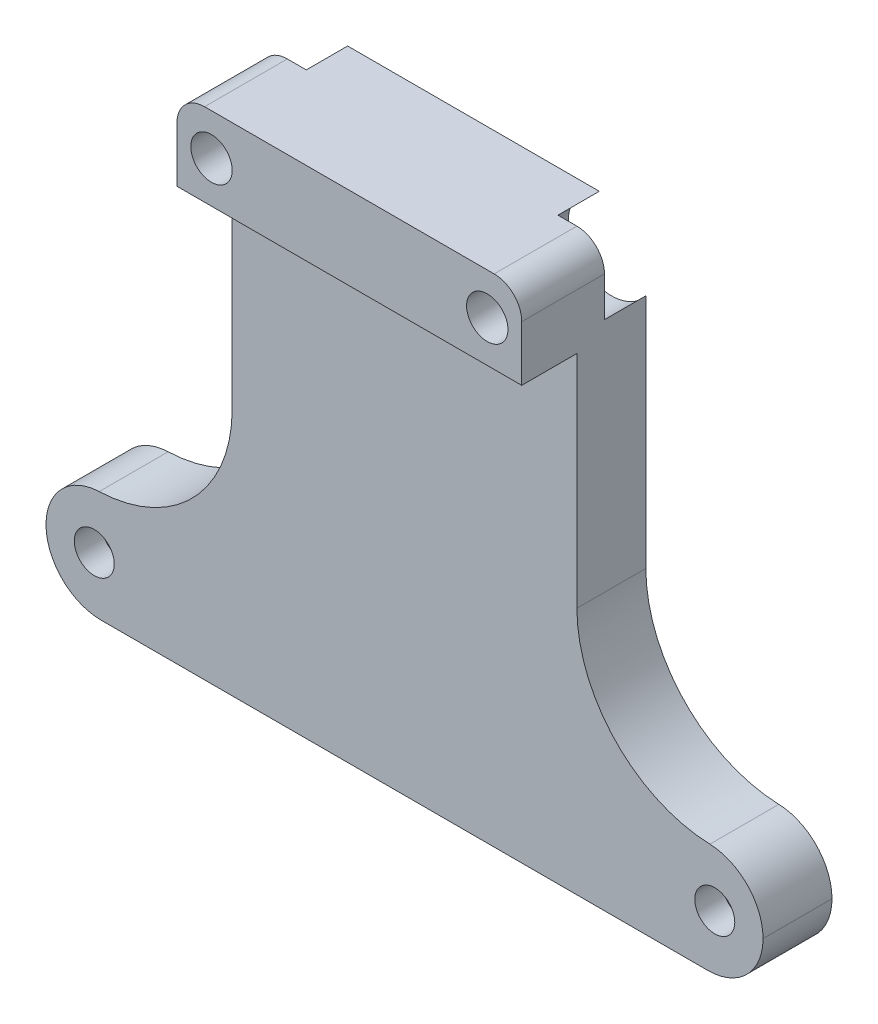
ISO-10303-21;
HEADER;
FILE_DESCRIPTION(('STEP AP214'),'2;1');
FILE_NAME('part.step','',(''),(''),'','','');
FILE_SCHEMA(('AUTOMOTIVE_DESIGN { 1 0 10303 214 1 1 1 1 }'));
ENDSEC;
DATA;
#1=APPLICATION_CONTEXT('core data for automotive mechanical design processes');
#2=APPLICATION_PROTOCOL_DEFINITION('international standard','automotive_design',2000,#1);
#3=PRODUCT_CONTEXT('',#1,'mechanical');
#4=PRODUCT('Part','Part','',(#3));
#5=PRODUCT_RELATED_PRODUCT_CATEGORY('part','',(#4));
#6=PRODUCT_DEFINITION_FORMATION('','',#4);
#7=PRODUCT_DEFINITION_CONTEXT('part definition',#1,'design');
#8=PRODUCT_DEFINITION('design','',#6,#7);
#9=PRODUCT_DEFINITION_SHAPE('','',#8);
#10=(LENGTH_UNIT() NAMED_UNIT(*) SI_UNIT(.MILLI.,.METRE.));
#11=(NAMED_UNIT(*) PLANE_ANGLE_UNIT() SI_UNIT($,.RADIAN.));
#12=(NAMED_UNIT(*) SI_UNIT($,.STERADIAN.) SOLID_ANGLE_UNIT());
#13=UNCERTAINTY_MEASURE_WITH_UNIT(LENGTH_MEASURE(1.E-05),#10,'distance_accuracy_value','');
#14=(GEOMETRIC_REPRESENTATION_CONTEXT(3) GLOBAL_UNCERTAINTY_ASSIGNED_CONTEXT((#13)) GLOBAL_UNIT_ASSIGNED_CONTEXT((#10,
#11,#12)) REPRESENTATION_CONTEXT('',''));
#15=CARTESIAN_POINT('',(0.,0.,0.));
#16=DIRECTION('',(0.,0.,1.));
#17=DIRECTION('',(1.,0.,0.));
#18=AXIS2_PLACEMENT_3D('',#15,#16,#17);
#19=CARTESIAN_POINT('',(-22.5,0.,5.));
#20=DIRECTION('',(0.,0.,-1.));
#21=DIRECTION('',(-1.,0.,0.));
#22=AXIS2_PLACEMENT_3D('',#19,#20,#21);
#23=CYLINDRICAL_SURFACE('',#22,1.45);
#24=CARTESIAN_POINT('',(-22.5,0.,5.));
#25=DIRECTION('',(0.,0.,1.));
#26=DIRECTION('',(1.,0.,0.));
#27=AXIS2_PLACEMENT_3D('',#24,#25,#26);
#28=CIRCLE('',#27,1.45);
#29=CARTESIAN_POINT('',(-21.05,0.,5.));
#30=VERTEX_POINT('',#29);
#31=EDGE_CURVE('E228',#30,#30,#28,.T.);
#32=ORIENTED_EDGE('',*,*,#31,.T.);
#33=EDGE_LOOP('',(#32));
#34=FACE_BOUND('',#33,.T.);
#35=CARTESIAN_POINT('',(-22.5,0.,3.));
#36=DIRECTION('',(0.,0.,-1.));
#37=DIRECTION('',(-1.,0.,0.));
#38=AXIS2_PLACEMENT_3D('',#35,#36,#37);
#39=CIRCLE('',#38,1.45);
#40=CARTESIAN_POINT('',(-23.95,0.,3.));
#41=VERTEX_POINT('',#40);
#42=EDGE_CURVE('E49',#41,#41,#39,.T.);
#43=ORIENTED_EDGE('',*,*,#42,.T.);
#44=EDGE_LOOP('',(#43));
#45=FACE_BOUND('',#44,.T.);
#46=ADVANCED_FACE('F45',(#34,#45),#23,.F.);
#47=CARTESIAN_POINT('',(22.5,0.,5.));
#48=DIRECTION('',(0.,0.,-1.));
#49=DIRECTION('',(-1.,0.,0.));
#50=AXIS2_PLACEMENT_3D('',#47,#48,#49);
#51=CYLINDRICAL_SURFACE('',#50,1.45);
#52=CARTESIAN_POINT('',(22.5,0.,5.));
#53=DIRECTION('',(0.,0.,1.));
#54=DIRECTION('',(1.,0.,0.));
#55=AXIS2_PLACEMENT_3D('',#52,#53,#54);
#56=CIRCLE('',#55,1.45);
#57=CARTESIAN_POINT('',(23.95,0.,5.));
#58=VERTEX_POINT('',#57);
#59=EDGE_CURVE('E224',#58,#58,#56,.T.);
#60=ORIENTED_EDGE('',*,*,#59,.T.);
#61=EDGE_LOOP('',(#60));
#62=FACE_BOUND('',#61,.T.);
#63=CARTESIAN_POINT('',(22.5,0.,3.));
#64=DIRECTION('',(0.,0.,-1.));
#65=DIRECTION('',(-1.,0.,0.));
#66=AXIS2_PLACEMENT_3D('',#63,#64,#65);
#67=CIRCLE('',#66,1.45);
#68=CARTESIAN_POINT('',(21.05,0.,3.));
#69=VERTEX_POINT('',#68);
#70=EDGE_CURVE('E356',#69,#69,#67,.T.);
#71=ORIENTED_EDGE('',*,*,#70,.T.);
#72=EDGE_LOOP('',(#71));
#73=FACE_BOUND('',#72,.T.);
#74=ADVANCED_FACE('F509',(#62,#73),#51,.F.);
#75=CARTESIAN_POINT('',(10.,32.9999999999999,5.));
#76=DIRECTION('',(0.,0.,-1.));
#77=DIRECTION('',(-1.,0.,0.));
#78=AXIS2_PLACEMENT_3D('',#75,#76,#77);
#79=CYLINDRICAL_SURFACE('',#78,1.5);
#80=CARTESIAN_POINT('',(10.,32.9999999999999,9.));
#81=DIRECTION('',(0.,0.,-1.));
#82=DIRECTION('',(-1.,0.,0.));
#83=AXIS2_PLACEMENT_3D('',#80,#81,#82);
#84=CIRCLE('',#83,1.5);
#85=CARTESIAN_POINT('',(8.5,32.9999999999999,9.));
#86=VERTEX_POINT('',#85);
#87=EDGE_CURVE('E364',#86,#86,#84,.T.);
#88=ORIENTED_EDGE('',*,*,#87,.F.);
#89=EDGE_LOOP('',(#88));
#90=FACE_BOUND('',#89,.T.);
#91=CARTESIAN_POINT('',(10.,32.9999999999999,3.));
#92=DIRECTION('',(0.,0.,-1.));
#93=DIRECTION('',(-1.,0.,0.));
#94=AXIS2_PLACEMENT_3D('',#91,#92,#93);
#95=CIRCLE('',#94,1.5);
#96=CARTESIAN_POINT('',(8.5,32.9999999999999,3.));
#97=VERTEX_POINT('',#96);
#98=EDGE_CURVE('E197',#97,#97,#95,.F.);
#99=ORIENTED_EDGE('',*,*,#98,.F.);
#100=EDGE_LOOP('',(#99));
#101=FACE_BOUND('',#100,.T.);
#102=ADVANCED_FACE('F506',(#90,#101),#79,.F.);
#103=CARTESIAN_POINT('',(-10.,33.,5.));
#104=DIRECTION('',(0.,0.,-1.));
#105=DIRECTION('',(-1.,0.,0.));
#106=AXIS2_PLACEMENT_3D('',#103,#104,#105);
#107=CYLINDRICAL_SURFACE('',#106,1.5);
#108=CARTESIAN_POINT('',(-10.,33.,9.));
#109=DIRECTION('',(0.,0.,-1.));
#110=DIRECTION('',(-1.,0.,0.));
#111=AXIS2_PLACEMENT_3D('',#108,#109,#110);
#112=CIRCLE('',#111,1.5);
#113=CARTESIAN_POINT('',(-11.5,33.,9.));
#114=VERTEX_POINT('',#113);
#115=EDGE_CURVE('E374',#114,#114,#112,.T.);
#116=ORIENTED_EDGE('',*,*,#115,.F.);
#117=EDGE_LOOP('',(#116));
#118=FACE_BOUND('',#117,.T.);
#119=CARTESIAN_POINT('',(-10.,33.,3.));
#120=DIRECTION('',(0.,0.,-1.));
#121=DIRECTION('',(-1.,0.,0.));
#122=AXIS2_PLACEMENT_3D('',#119,#120,#121);
#123=CIRCLE('',#122,1.5);
#124=CARTESIAN_POINT('',(-11.5,33.,3.));
#125=VERTEX_POINT('',#124);
#126=EDGE_CURVE('E491',#125,#125,#123,.F.);
#127=ORIENTED_EDGE('',*,*,#126,.F.);
#128=EDGE_LOOP('',(#127));
#129=FACE_BOUND('',#128,.T.);
#130=ADVANCED_FACE('F508',(#118,#129),#107,.F.);
#131=CARTESIAN_POINT('',(10.5,34.,5.));
#132=DIRECTION('',(0.,0.,-1.));
#133=DIRECTION('',(-1.,0.,0.));
#134=AXIS2_PLACEMENT_3D('',#131,#132,#133);
#135=CYLINDRICAL_SURFACE('',#134,2.);
#136=DIRECTION('',(0.,0.,-1.));
#137=VECTOR('',#136,1.);
#138=CARTESIAN_POINT('',(12.5,34.,5.));
#139=LINE('',#138,#137);
#140=CARTESIAN_POINT('',(12.5,34.,3.));
#141=VERTEX_POINT('',#140);
#142=CARTESIAN_POINT('',(12.5,34.,9.));
#143=VERTEX_POINT('',#142);
#144=EDGE_CURVE('E336',#141,#143,#139,.F.);
#145=ORIENTED_EDGE('',*,*,#144,.F.);
#146=CARTESIAN_POINT('',(10.5,34.,3.));
#147=DIRECTION('',(0.,0.,-1.));
#148=DIRECTION('',(-1.,0.,0.));
#149=AXIS2_PLACEMENT_3D('',#146,#147,#148);
#150=CIRCLE('',#149,2.);
#151=CARTESIAN_POINT('',(10.5,36.,3.));
#152=VERTEX_POINT('',#151);
#153=EDGE_CURVE('E352',#141,#152,#150,.F.);
#154=ORIENTED_EDGE('',*,*,#153,.T.);
#155=DIRECTION('',(0.,0.,-1.));
#156=VECTOR('',#155,1.);
#157=CARTESIAN_POINT('',(10.5,36.,5.));
#158=LINE('',#157,#156);
#159=CARTESIAN_POINT('',(10.5,36.,9.));
#160=VERTEX_POINT('',#159);
#161=EDGE_CURVE('E332',#160,#152,#158,.T.);
#162=ORIENTED_EDGE('',*,*,#161,.F.);
#163=CARTESIAN_POINT('',(10.5,34.,9.));
#164=DIRECTION('',(0.,0.,-1.));
#165=DIRECTION('',(-1.,0.,0.));
#166=AXIS2_PLACEMENT_3D('',#163,#164,#165);
#167=CIRCLE('',#166,2.);
#168=EDGE_CURVE('E342',#143,#160,#167,.F.);
#169=ORIENTED_EDGE('',*,*,#168,.F.);
#170=EDGE_LOOP('',(#145,#154,#162,#169));
#171=FACE_BOUND('',#170,.T.);
#172=ADVANCED_FACE('F516',(#171),#135,.T.);
#173=CARTESIAN_POINT('',(-10.5,34.,5.));
#174=DIRECTION('',(0.,0.,-1.));
#175=DIRECTION('',(-1.,0.,0.));
#176=AXIS2_PLACEMENT_3D('',#173,#174,#175);
#177=CYLINDRICAL_SURFACE('',#176,2.);
#178=DIRECTION('',(0.,0.,-1.));
#179=VECTOR('',#178,1.);
#180=CARTESIAN_POINT('',(-10.5,36.,5.));
#181=LINE('',#180,#179);
#182=CARTESIAN_POINT('',(-10.5,36.,3.));
#183=VERTEX_POINT('',#182);
#184=CARTESIAN_POINT('',(-10.5,36.,9.));
#185=VERTEX_POINT('',#184);
#186=EDGE_CURVE('E329',#183,#185,#181,.F.);
#187=ORIENTED_EDGE('',*,*,#186,.F.);
#188=CARTESIAN_POINT('',(-10.5,34.,3.));
#189=DIRECTION('',(0.,0.,-1.));
#190=DIRECTION('',(-1.,0.,0.));
#191=AXIS2_PLACEMENT_3D('',#188,#189,#190);
#192=CIRCLE('',#191,2.);
#193=CARTESIAN_POINT('',(-12.5,34.,3.));
#194=VERTEX_POINT('',#193);
#195=EDGE_CURVE('E349',#183,#194,#192,.F.);
#196=ORIENTED_EDGE('',*,*,#195,.T.);
#197=DIRECTION('',(0.,0.,-1.));
#198=VECTOR('',#197,1.);
#199=CARTESIAN_POINT('',(-12.5,34.,5.));
#200=LINE('',#199,#198);
#201=CARTESIAN_POINT('',(-12.5,34.,9.));
#202=VERTEX_POINT('',#201);
#203=EDGE_CURVE('E345',#202,#194,#200,.T.);
#204=ORIENTED_EDGE('',*,*,#203,.F.);
#205=CARTESIAN_POINT('',(-10.5,34.,9.));
#206=DIRECTION('',(0.,0.,-1.));
#207=DIRECTION('',(-1.,0.,0.));
#208=AXIS2_PLACEMENT_3D('',#205,#206,#207);
#209=CIRCLE('',#208,2.);
#210=EDGE_CURVE('E339',#185,#202,#209,.F.);
#211=ORIENTED_EDGE('',*,*,#210,.F.);
#212=EDGE_LOOP('',(#187,#196,#204,#211));
#213=FACE_BOUND('',#212,.T.);
#214=ADVANCED_FACE('F47',(#213),#177,.T.);
#215=CARTESIAN_POINT('',(0.,0.,5.));
#216=DIRECTION('',(0.,0.,-1.));
#217=DIRECTION('',(-1.,0.,0.));
#218=AXIS2_PLACEMENT_3D('',#215,#216,#217);
#219=PLANE('',#218);
#220=DIRECTION('',(0.,-1.,0.));
#221=VECTOR('',#220,1.);
#222=CARTESIAN_POINT('',(-26.,-4.,5.));
#223=LINE('',#222,#221);
#224=CARTESIAN_POINT('',(-26.,0.00893142036677806,5.));
#225=VERTEX_POINT('',#224);
#226=CARTESIAN_POINT('',(-26.,0.,5.));
#227=VERTEX_POINT('',#226);
#228=EDGE_CURVE('E237',#225,#227,#223,.T.);
#229=ORIENTED_EDGE('',*,*,#228,.T.);
#230=CARTESIAN_POINT('',(-22.,0.,5.));
#231=DIRECTION('',(0.,0.,-1.));
#232=DIRECTION('',(-1.,0.,0.));
#233=AXIS2_PLACEMENT_3D('',#230,#231,#232);
#234=CIRCLE('',#233,4.);
#235=CARTESIAN_POINT('',(-22.,-4.,5.));
#236=VERTEX_POINT('',#235);
#237=EDGE_CURVE('E312',#227,#236,#234,.F.);
#238=ORIENTED_EDGE('',*,*,#237,.T.);
#239=DIRECTION('',(1.,0.,0.));
#240=VECTOR('',#239,1.);
#241=CARTESIAN_POINT('',(-26.,-4.,5.));
#242=LINE('',#241,#240);
#243=CARTESIAN_POINT('',(22.,-4.,5.));
#244=VERTEX_POINT('',#243);
#245=EDGE_CURVE('E242',#236,#244,#242,.T.);
#246=ORIENTED_EDGE('',*,*,#245,.T.);
#247=CARTESIAN_POINT('',(22.,0.,5.));
#248=DIRECTION('',(0.,0.,-1.));
#249=DIRECTION('',(-1.,0.,0.));
#250=AXIS2_PLACEMENT_3D('',#247,#248,#249);
#251=CIRCLE('',#250,4.);
#252=CARTESIAN_POINT('',(26.,0.,5.));
#253=VERTEX_POINT('',#252);
#254=EDGE_CURVE('E306',#244,#253,#251,.F.);
#255=ORIENTED_EDGE('',*,*,#254,.T.);
#256=DIRECTION('',(0.,1.,0.));
#257=VECTOR('',#256,1.);
#258=CARTESIAN_POINT('',(26.,-4.,5.));
#259=LINE('',#258,#257);
#260=CARTESIAN_POINT('',(26.,0.00893142036677806,5.));
#261=VERTEX_POINT('',#260);
#262=EDGE_CURVE('E233',#253,#261,#259,.T.);
#263=ORIENTED_EDGE('',*,*,#262,.T.);
#264=CARTESIAN_POINT('',(22.,0.00893142036677806,5.));
#265=DIRECTION('',(0.,0.,-1.));
#266=DIRECTION('',(-1.,0.,0.));
#267=AXIS2_PLACEMENT_3D('',#264,#265,#266);
#268=CIRCLE('',#267,4.);
#269=CARTESIAN_POINT('',(22.1428571428571,4.00637958597627,5.));
#270=VERTEX_POINT('',#269);
#271=EDGE_CURVE('E303',#261,#270,#268,.F.);
#272=ORIENTED_EDGE('',*,*,#271,.T.);
#273=CARTESIAN_POINT('',(22.5,14.,5.));
#274=DIRECTION('',(0.,0.,-1.));
#275=DIRECTION('',(-1.,0.,0.));
#276=AXIS2_PLACEMENT_3D('',#273,#274,#275);
#277=CIRCLE('',#276,10.);
#278=CARTESIAN_POINT('',(12.5,14.,5.));
#279=VERTEX_POINT('',#278);
#280=EDGE_CURVE('E267',#270,#279,#277,.T.);
#281=ORIENTED_EDGE('',*,*,#280,.T.);
#282=DIRECTION('',(0.,-1.,0.));
#283=VECTOR('',#282,1.);
#284=CARTESIAN_POINT('',(12.5,4.,5.));
#285=LINE('',#284,#283);
#286=CARTESIAN_POINT('',(12.5,30.,5.));
#287=VERTEX_POINT('',#286);
#288=EDGE_CURVE('E213',#287,#279,#285,.T.);
#289=ORIENTED_EDGE('',*,*,#288,.F.);
#290=DIRECTION('',(-1.,0.,0.));
#291=VECTOR('',#290,1.);
#292=CARTESIAN_POINT('',(12.5,30.,5.));
#293=LINE('',#292,#291);
#294=CARTESIAN_POINT('',(-12.5,30.,5.));
#295=VERTEX_POINT('',#294);
#296=EDGE_CURVE('E378',#287,#295,#293,.T.);
#297=ORIENTED_EDGE('',*,*,#296,.T.);
#298=DIRECTION('',(0.,1.,0.));
#299=VECTOR('',#298,1.);
#300=CARTESIAN_POINT('',(-12.5,4.,5.));
#301=LINE('',#300,#299);
#302=CARTESIAN_POINT('',(-12.5,14.,5.));
#303=VERTEX_POINT('',#302);
#304=EDGE_CURVE('E218',#303,#295,#301,.T.);
#305=ORIENTED_EDGE('',*,*,#304,.F.);
#306=CARTESIAN_POINT('',(-22.5,14.,5.));
#307=DIRECTION('',(0.,0.,-1.));
#308=DIRECTION('',(-1.,0.,0.));
#309=AXIS2_PLACEMENT_3D('',#306,#307,#308);
#310=CIRCLE('',#309,10.);
#311=CARTESIAN_POINT('',(-22.1428571428571,4.00637958597627,5.));
#312=VERTEX_POINT('',#311);
#313=EDGE_CURVE('E273',#303,#312,#310,.T.);
#314=ORIENTED_EDGE('',*,*,#313,.T.);
#315=CARTESIAN_POINT('',(-22.,0.00893142036677806,5.));
#316=DIRECTION('',(0.,0.,-1.));
#317=DIRECTION('',(-1.,0.,0.));
#318=AXIS2_PLACEMENT_3D('',#315,#316,#317);
#319=CIRCLE('',#318,4.);
#320=EDGE_CURVE('E309',#312,#225,#319,.F.);
#321=ORIENTED_EDGE('',*,*,#320,.T.);
#322=EDGE_LOOP('',(#229,#238,#246,#255,#263,#272,#281,#289,#297,#305,#314,#321));
#323=FACE_BOUND('',#322,.T.);
#324=ORIENTED_EDGE('',*,*,#31,.F.);
#325=EDGE_LOOP('',(#324));
#326=FACE_BOUND('',#325,.T.);
#327=ORIENTED_EDGE('',*,*,#59,.F.);
#328=EDGE_LOOP('',(#327));
#329=FACE_BOUND('',#328,.T.);
#330=ADVANCED_FACE('F419',(#323,#326,#329),#219,.F.);
#331=CARTESIAN_POINT('',(0.,0.,0.));
#332=DIRECTION('',(0.,0.,-1.));
#333=DIRECTION('',(-1.,0.,0.));
#334=AXIS2_PLACEMENT_3D('',#331,#332,#333);
#335=PLANE('',#334);
#336=CARTESIAN_POINT('',(-22.5,0.,0.));
#337=DIRECTION('',(0.,0.,-1.));
#338=DIRECTION('',(-1.,0.,0.));
#339=AXIS2_PLACEMENT_3D('',#336,#337,#338);
#340=CIRCLE('',#339,3.125);
#341=CARTESIAN_POINT('',(-25.625,0.,0.));
#342=VERTEX_POINT('',#341);
#343=EDGE_CURVE('E474',#342,#342,#340,.T.);
#344=ORIENTED_EDGE('',*,*,#343,.F.);
#345=EDGE_LOOP('',(#344));
#346=FACE_BOUND('',#345,.T.);
#347=CARTESIAN_POINT('',(22.5,0.,0.));
#348=DIRECTION('',(0.,0.,-1.));
#349=DIRECTION('',(-1.,0.,0.));
#350=AXIS2_PLACEMENT_3D('',#347,#348,#349);
#351=CIRCLE('',#350,3.125);
#352=CARTESIAN_POINT('',(19.375,0.,0.));
#353=VERTEX_POINT('',#352);
#354=EDGE_CURVE('E464',#353,#353,#351,.T.);
#355=ORIENTED_EDGE('',*,*,#354,.F.);
#356=EDGE_LOOP('',(#355));
#357=FACE_BOUND('',#356,.T.);
#358=CARTESIAN_POINT('',(-10.,33.,0.));
#359=DIRECTION('',(0.,0.,-1.));
#360=DIRECTION('',(-1.,0.,0.));
#361=AXIS2_PLACEMENT_3D('',#358,#359,#360);
#362=CIRCLE('',#361,3.125);
#363=CARTESIAN_POINT('',(-9.12500000000001,36.,0.));
#364=VERTEX_POINT('',#363);
#365=CARTESIAN_POINT('',(-12.5,31.125,0.));
#366=VERTEX_POINT('',#365);
#367=EDGE_CURVE('E189',#364,#366,#362,.T.);
#368=ORIENTED_EDGE('',*,*,#367,.F.);
#369=DIRECTION('',(1.,0.,0.));
#370=VECTOR('',#369,1.);
#371=CARTESIAN_POINT('',(12.5,36.,0.));
#372=LINE('',#371,#370);
#373=CARTESIAN_POINT('',(9.12500000000029,36.,0.));
#374=VERTEX_POINT('',#373);
#375=EDGE_CURVE('E204',#364,#374,#372,.T.);
#376=ORIENTED_EDGE('',*,*,#375,.T.);
#377=CARTESIAN_POINT('',(10.,32.9999999999999,0.));
#378=DIRECTION('',(0.,0.,-1.));
#379=DIRECTION('',(-1.,0.,0.));
#380=AXIS2_PLACEMENT_3D('',#377,#378,#379);
#381=CIRCLE('',#380,3.125);
#382=CARTESIAN_POINT('',(12.5,31.1249999999999,0.));
#383=VERTEX_POINT('',#382);
#384=EDGE_CURVE('E208',#383,#374,#381,.T.);
#385=ORIENTED_EDGE('',*,*,#384,.F.);
#386=DIRECTION('',(0.,-1.,0.));
#387=VECTOR('',#386,1.);
#388=CARTESIAN_POINT('',(12.5,4.,0.));
#389=LINE('',#388,#387);
#390=CARTESIAN_POINT('',(12.5,14.,0.));
#391=VERTEX_POINT('',#390);
#392=EDGE_CURVE('E220',#383,#391,#389,.T.);
#393=ORIENTED_EDGE('',*,*,#392,.T.);
#394=CARTESIAN_POINT('',(22.5,14.,0.));
#395=DIRECTION('',(0.,0.,-1.));
#396=DIRECTION('',(-1.,0.,0.));
#397=AXIS2_PLACEMENT_3D('',#394,#395,#396);
#398=CIRCLE('',#397,10.);
#399=CARTESIAN_POINT('',(22.1428571428571,4.00637958597627,0.));
#400=VERTEX_POINT('',#399);
#401=EDGE_CURVE('E263',#391,#400,#398,.F.);
#402=ORIENTED_EDGE('',*,*,#401,.T.);
#403=CARTESIAN_POINT('',(22.,0.00893142036677806,0.));
#404=DIRECTION('',(0.,0.,-1.));
#405=DIRECTION('',(-1.,0.,0.));
#406=AXIS2_PLACEMENT_3D('',#403,#404,#405);
#407=CIRCLE('',#406,4.);
#408=CARTESIAN_POINT('',(26.,0.00893142036677806,0.));
#409=VERTEX_POINT('',#408);
#410=EDGE_CURVE('E284',#400,#409,#407,.T.);
#411=ORIENTED_EDGE('',*,*,#410,.T.);
#412=DIRECTION('',(0.,1.,0.));
#413=VECTOR('',#412,1.);
#414=CARTESIAN_POINT('',(26.,-4.,0.));
#415=LINE('',#414,#413);
#416=CARTESIAN_POINT('',(26.,0.,0.));
#417=VERTEX_POINT('',#416);
#418=EDGE_CURVE('E232',#417,#409,#415,.T.);
#419=ORIENTED_EDGE('',*,*,#418,.F.);
#420=CARTESIAN_POINT('',(22.,0.,0.));
#421=DIRECTION('',(0.,0.,-1.));
#422=DIRECTION('',(-1.,0.,0.));
#423=AXIS2_PLACEMENT_3D('',#420,#421,#422);
#424=CIRCLE('',#423,4.);
#425=CARTESIAN_POINT('',(22.,-4.,0.));
#426=VERTEX_POINT('',#425);
#427=EDGE_CURVE('E287',#417,#426,#424,.T.);
#428=ORIENTED_EDGE('',*,*,#427,.T.);
#429=DIRECTION('',(1.,0.,0.));
#430=VECTOR('',#429,1.);
#431=CARTESIAN_POINT('',(-26.,-4.,0.));
#432=LINE('',#431,#430);
#433=CARTESIAN_POINT('',(-22.,-4.,0.));
#434=VERTEX_POINT('',#433);
#435=EDGE_CURVE('E238',#434,#426,#432,.T.);
#436=ORIENTED_EDGE('',*,*,#435,.F.);
#437=CARTESIAN_POINT('',(-22.,0.,0.));
#438=DIRECTION('',(0.,0.,-1.));
#439=DIRECTION('',(-1.,0.,0.));
#440=AXIS2_PLACEMENT_3D('',#437,#438,#439);
#441=CIRCLE('',#440,4.);
#442=CARTESIAN_POINT('',(-26.,0.,0.));
#443=VERTEX_POINT('',#442);
#444=EDGE_CURVE('E293',#434,#443,#441,.T.);
#445=ORIENTED_EDGE('',*,*,#444,.T.);
#446=DIRECTION('',(0.,-1.,0.));
#447=VECTOR('',#446,1.);
#448=CARTESIAN_POINT('',(-26.,-4.,0.));
#449=LINE('',#448,#447);
#450=CARTESIAN_POINT('',(-26.,0.00893142036677806,0.));
#451=VERTEX_POINT('',#450);
#452=EDGE_CURVE('E250',#451,#443,#449,.T.);
#453=ORIENTED_EDGE('',*,*,#452,.F.);
#454=CARTESIAN_POINT('',(-22.,0.00893142036677806,0.));
#455=DIRECTION('',(0.,0.,-1.));
#456=DIRECTION('',(-1.,0.,0.));
#457=AXIS2_PLACEMENT_3D('',#454,#455,#456);
#458=CIRCLE('',#457,4.);
#459=CARTESIAN_POINT('',(-22.1428571428571,4.00637958597627,0.));
#460=VERTEX_POINT('',#459);
#461=EDGE_CURVE('E290',#451,#460,#458,.T.);
#462=ORIENTED_EDGE('',*,*,#461,.T.);
#463=CARTESIAN_POINT('',(-22.5,14.,0.));
#464=DIRECTION('',(0.,0.,-1.));
#465=DIRECTION('',(-1.,0.,0.));
#466=AXIS2_PLACEMENT_3D('',#463,#464,#465);
#467=CIRCLE('',#466,10.);
#468=CARTESIAN_POINT('',(-12.5,14.,0.));
#469=VERTEX_POINT('',#468);
#470=EDGE_CURVE('E270',#460,#469,#467,.F.);
#471=ORIENTED_EDGE('',*,*,#470,.T.);
#472=DIRECTION('',(0.,1.,0.));
#473=VECTOR('',#472,1.);
#474=CARTESIAN_POINT('',(-12.5,4.,0.));
#475=LINE('',#474,#473);
#476=EDGE_CURVE('E206',#469,#366,#475,.T.);
#477=ORIENTED_EDGE('',*,*,#476,.T.);
#478=EDGE_LOOP('',(#368,#376,#385,#393,#402,#411,#419,#428,#436,#445,#453,#462,#471,#477));
#479=FACE_BOUND('',#478,.T.);
#480=ADVANCED_FACE('F202',(#346,#357,#479),#335,.T.);
#481=CARTESIAN_POINT('',(26.,-4.,5.));
#482=DIRECTION('',(-1.,0.,0.));
#483=DIRECTION('',(0.,0.,1.));
#484=AXIS2_PLACEMENT_3D('',#481,#482,#483);
#485=PLANE('',#484);
#486=ORIENTED_EDGE('',*,*,#262,.F.);
#487=DIRECTION('',(0.,0.,-1.));
#488=VECTOR('',#487,1.);
#489=CARTESIAN_POINT('',(26.,0.,5.));
#490=LINE('',#489,#488);
#491=EDGE_CURVE('E321',#253,#417,#490,.T.);
#492=ORIENTED_EDGE('',*,*,#491,.T.);
#493=ORIENTED_EDGE('',*,*,#418,.T.);
#494=DIRECTION('',(0.,0.,-1.));
#495=VECTOR('',#494,1.);
#496=CARTESIAN_POINT('',(26.,0.00893142036677806,5.));
#497=LINE('',#496,#495);
#498=EDGE_CURVE('E318',#409,#261,#497,.F.);
#499=ORIENTED_EDGE('',*,*,#498,.T.);
#500=EDGE_LOOP('',(#486,#492,#493,#499));
#501=FACE_BOUND('',#500,.T.);
#502=ADVANCED_FACE('F429',(#501),#485,.F.);
#503=CARTESIAN_POINT('',(-26.,-4.,5.));
#504=DIRECTION('',(1.,0.,0.));
#505=DIRECTION('',(0.,0.,-1.));
#506=AXIS2_PLACEMENT_3D('',#503,#504,#505);
#507=PLANE('',#506);
#508=ORIENTED_EDGE('',*,*,#452,.T.);
#509=DIRECTION('',(0.,0.,-1.));
#510=VECTOR('',#509,1.);
#511=CARTESIAN_POINT('',(-26.,0.,5.));
#512=LINE('',#511,#510);
#513=EDGE_CURVE('E300',#443,#227,#512,.F.);
#514=ORIENTED_EDGE('',*,*,#513,.T.);
#515=ORIENTED_EDGE('',*,*,#228,.F.);
#516=DIRECTION('',(0.,0.,-1.));
#517=VECTOR('',#516,1.);
#518=CARTESIAN_POINT('',(-26.,0.00893142036677806,5.));
#519=LINE('',#518,#517);
#520=EDGE_CURVE('E296',#225,#451,#519,.T.);
#521=ORIENTED_EDGE('',*,*,#520,.T.);
#522=EDGE_LOOP('',(#508,#514,#515,#521));
#523=FACE_BOUND('',#522,.T.);
#524=ADVANCED_FACE('F446',(#523),#507,.F.);
#525=CARTESIAN_POINT('',(-26.,-4.,5.));
#526=DIRECTION('',(0.,1.,0.));
#527=DIRECTION('',(0.,0.,1.));
#528=AXIS2_PLACEMENT_3D('',#525,#526,#527);
#529=PLANE('',#528);
#530=ORIENTED_EDGE('',*,*,#245,.F.);
#531=DIRECTION('',(0.,0.,-1.));
#532=VECTOR('',#531,1.);
#533=CARTESIAN_POINT('',(-22.,-4.,5.));
#534=LINE('',#533,#532);
#535=EDGE_CURVE('E280',#236,#434,#534,.T.);
#536=ORIENTED_EDGE('',*,*,#535,.T.);
#537=ORIENTED_EDGE('',*,*,#435,.T.);
#538=DIRECTION('',(0.,0.,-1.));
#539=VECTOR('',#538,1.);
#540=CARTESIAN_POINT('',(22.,-4.,5.));
#541=LINE('',#540,#539);
#542=EDGE_CURVE('E277',#426,#244,#541,.F.);
#543=ORIENTED_EDGE('',*,*,#542,.T.);
#544=EDGE_LOOP('',(#530,#536,#537,#543));
#545=FACE_BOUND('',#544,.T.);
#546=ADVANCED_FACE('F438',(#545),#529,.F.);
#547=CARTESIAN_POINT('',(12.5,4.,5.));
#548=DIRECTION('',(1.,0.,0.));
#549=DIRECTION('',(0.,0.,-1.));
#550=AXIS2_PLACEMENT_3D('',#547,#548,#549);
#551=PLANE('',#550);
#552=DIRECTION('',(0.,0.,-1.));
#553=VECTOR('',#552,1.);
#554=CARTESIAN_POINT('',(12.5,31.1249999999999,3.));
#555=LINE('',#554,#553);
#556=CARTESIAN_POINT('',(12.5,31.1249999999999,3.));
#557=VERTEX_POINT('',#556);
#558=EDGE_CURVE('E196',#557,#383,#555,.T.);
#559=ORIENTED_EDGE('',*,*,#558,.F.);
#560=DIRECTION('',(0.,1.,0.));
#561=VECTOR('',#560,1.);
#562=CARTESIAN_POINT('',(12.5,4.,3.));
#563=LINE('',#562,#561);
#564=EDGE_CURVE('E497',#557,#141,#563,.T.);
#565=ORIENTED_EDGE('',*,*,#564,.T.);
#566=ORIENTED_EDGE('',*,*,#144,.T.);
#567=DIRECTION('',(0.,-1.,0.));
#568=VECTOR('',#567,1.);
#569=CARTESIAN_POINT('',(12.5,36.,9.));
#570=LINE('',#569,#568);
#571=CARTESIAN_POINT('',(12.5,30.,9.));
#572=VERTEX_POINT('',#571);
#573=EDGE_CURVE('E379',#143,#572,#570,.T.);
#574=ORIENTED_EDGE('',*,*,#573,.T.);
#575=DIRECTION('',(0.,0.,-1.));
#576=VECTOR('',#575,1.);
#577=CARTESIAN_POINT('',(12.5,30.,9.));
#578=LINE('',#577,#576);
#579=EDGE_CURVE('E394',#572,#287,#578,.T.);
#580=ORIENTED_EDGE('',*,*,#579,.T.);
#581=ORIENTED_EDGE('',*,*,#288,.T.);
#582=DIRECTION('',(0.,0.,-1.));
#583=VECTOR('',#582,1.);
#584=CARTESIAN_POINT('',(12.5,14.,5.));
#585=LINE('',#584,#583);
#586=EDGE_CURVE('E246',#279,#391,#585,.T.);
#587=ORIENTED_EDGE('',*,*,#586,.T.);
#588=ORIENTED_EDGE('',*,*,#392,.F.);
#589=EDGE_LOOP('',(#559,#565,#566,#574,#580,#581,#587,#588));
#590=FACE_BOUND('',#589,.T.);
#591=ADVANCED_FACE('F414',(#590),#551,.T.);
#592=CARTESIAN_POINT('',(12.5,36.,5.));
#593=DIRECTION('',(0.,1.,0.));
#594=DIRECTION('',(0.,0.,1.));
#595=AXIS2_PLACEMENT_3D('',#592,#593,#594);
#596=PLANE('',#595);
#597=DIRECTION('',(0.,0.,-1.));
#598=VECTOR('',#597,1.);
#599=CARTESIAN_POINT('',(-9.12500000000001,36.,3.));
#600=LINE('',#599,#598);
#601=CARTESIAN_POINT('',(-9.12500000000001,36.,3.));
#602=VERTEX_POINT('',#601);
#603=EDGE_CURVE('E186',#602,#364,#600,.T.);
#604=ORIENTED_EDGE('',*,*,#603,.F.);
#605=DIRECTION('',(-1.,0.,0.));
#606=VECTOR('',#605,1.);
#607=CARTESIAN_POINT('',(12.5,36.,3.));
#608=LINE('',#607,#606);
#609=EDGE_CURVE('E462',#602,#183,#608,.T.);
#610=ORIENTED_EDGE('',*,*,#609,.T.);
#611=ORIENTED_EDGE('',*,*,#186,.T.);
#612=DIRECTION('',(1.,0.,0.));
#613=VECTOR('',#612,1.);
#614=CARTESIAN_POINT('',(12.5,36.,9.));
#615=LINE('',#614,#613);
#616=EDGE_CURVE('E390',#185,#160,#615,.T.);
#617=ORIENTED_EDGE('',*,*,#616,.T.);
#618=ORIENTED_EDGE('',*,*,#161,.T.);
#619=DIRECTION('',(-1.,0.,0.));
#620=VECTOR('',#619,1.);
#621=CARTESIAN_POINT('',(12.5,36.,3.));
#622=LINE('',#621,#620);
#623=CARTESIAN_POINT('',(9.12500000000029,36.,3.));
#624=VERTEX_POINT('',#623);
#625=EDGE_CURVE('E63',#152,#624,#622,.T.);
#626=ORIENTED_EDGE('',*,*,#625,.T.);
#627=DIRECTION('',(0.,0.,-1.));
#628=VECTOR('',#627,1.);
#629=CARTESIAN_POINT('',(9.12500000000029,36.,3.));
#630=LINE('',#629,#628);
#631=EDGE_CURVE('E11',#374,#624,#630,.F.);
#632=ORIENTED_EDGE('',*,*,#631,.F.);
#633=ORIENTED_EDGE('',*,*,#375,.F.);
#634=EDGE_LOOP('',(#604,#610,#611,#617,#618,#626,#632,#633));
#635=FACE_BOUND('',#634,.T.);
#636=ADVANCED_FACE('F211',(#635),#596,.T.);
#637=CARTESIAN_POINT('',(-12.5,4.,5.));
#638=DIRECTION('',(-1.,0.,0.));
#639=DIRECTION('',(0.,0.,1.));
#640=AXIS2_PLACEMENT_3D('',#637,#638,#639);
#641=PLANE('',#640);
#642=DIRECTION('',(0.,0.,-1.));
#643=VECTOR('',#642,1.);
#644=CARTESIAN_POINT('',(-12.5,31.125,3.));
#645=LINE('',#644,#643);
#646=CARTESIAN_POINT('',(-12.5,31.125,3.));
#647=VERTEX_POINT('',#646);
#648=EDGE_CURVE('E55',#366,#647,#645,.F.);
#649=ORIENTED_EDGE('',*,*,#648,.F.);
#650=ORIENTED_EDGE('',*,*,#476,.F.);
#651=DIRECTION('',(0.,0.,-1.));
#652=VECTOR('',#651,1.);
#653=CARTESIAN_POINT('',(-12.5,14.,5.));
#654=LINE('',#653,#652);
#655=EDGE_CURVE('E260',#469,#303,#654,.F.);
#656=ORIENTED_EDGE('',*,*,#655,.T.);
#657=ORIENTED_EDGE('',*,*,#304,.T.);
#658=DIRECTION('',(0.,0.,-1.));
#659=VECTOR('',#658,1.);
#660=CARTESIAN_POINT('',(-12.5,30.,9.));
#661=LINE('',#660,#659);
#662=CARTESIAN_POINT('',(-12.5,30.,9.));
#663=VERTEX_POINT('',#662);
#664=EDGE_CURVE('E398',#663,#295,#661,.T.);
#665=ORIENTED_EDGE('',*,*,#664,.F.);
#666=DIRECTION('',(0.,1.,0.));
#667=VECTOR('',#666,1.);
#668=CARTESIAN_POINT('',(-12.5,36.,9.));
#669=LINE('',#668,#667);
#670=EDGE_CURVE('E386',#663,#202,#669,.T.);
#671=ORIENTED_EDGE('',*,*,#670,.T.);
#672=ORIENTED_EDGE('',*,*,#203,.T.);
#673=DIRECTION('',(0.,-1.,0.));
#674=VECTOR('',#673,1.);
#675=CARTESIAN_POINT('',(-12.5,4.,3.));
#676=LINE('',#675,#674);
#677=EDGE_CURVE('E71',#194,#647,#676,.T.);
#678=ORIENTED_EDGE('',*,*,#677,.T.);
#679=EDGE_LOOP('',(#649,#650,#656,#657,#665,#671,#672,#678));
#680=FACE_BOUND('',#679,.T.);
#681=ADVANCED_FACE('F459',(#680),#641,.T.);
#682=CARTESIAN_POINT('',(12.5,30.,9.));
#683=DIRECTION('',(0.,-1.,0.));
#684=DIRECTION('',(0.,0.,-1.));
#685=AXIS2_PLACEMENT_3D('',#682,#683,#684);
#686=PLANE('',#685);
#687=ORIENTED_EDGE('',*,*,#296,.F.);
#688=ORIENTED_EDGE('',*,*,#579,.F.);
#689=DIRECTION('',(-1.,0.,0.));
#690=VECTOR('',#689,1.);
#691=CARTESIAN_POINT('',(12.5,30.,9.));
#692=LINE('',#691,#690);
#693=EDGE_CURVE('E382',#572,#663,#692,.T.);
#694=ORIENTED_EDGE('',*,*,#693,.T.);
#695=ORIENTED_EDGE('',*,*,#664,.T.);
#696=EDGE_LOOP('',(#687,#688,#694,#695));
#697=FACE_BOUND('',#696,.T.);
#698=ADVANCED_FACE('F570',(#697),#686,.T.);
#699=CARTESIAN_POINT('',(0.,0.,9.));
#700=DIRECTION('',(0.,0.,-1.));
#701=DIRECTION('',(-1.,0.,0.));
#702=AXIS2_PLACEMENT_3D('',#699,#700,#701);
#703=PLANE('',#702);
#704=ORIENTED_EDGE('',*,*,#87,.T.);
#705=EDGE_LOOP('',(#704));
#706=FACE_BOUND('',#705,.T.);
#707=ORIENTED_EDGE('',*,*,#115,.T.);
#708=EDGE_LOOP('',(#707));
#709=FACE_BOUND('',#708,.T.);
#710=ORIENTED_EDGE('',*,*,#573,.F.);
#711=ORIENTED_EDGE('',*,*,#168,.T.);
#712=ORIENTED_EDGE('',*,*,#616,.F.);
#713=ORIENTED_EDGE('',*,*,#210,.T.);
#714=ORIENTED_EDGE('',*,*,#670,.F.);
#715=ORIENTED_EDGE('',*,*,#693,.F.);
#716=EDGE_LOOP('',(#710,#711,#712,#713,#714,#715));
#717=FACE_BOUND('',#716,.T.);
#718=ADVANCED_FACE('F545',(#706,#709,#717),#703,.F.);
#719=CARTESIAN_POINT('',(22.5,14.,5.));
#720=DIRECTION('',(0.,0.,-1.));
#721=DIRECTION('',(-1.,0.,0.));
#722=AXIS2_PLACEMENT_3D('',#719,#720,#721);
#723=CYLINDRICAL_SURFACE('',#722,10.);
#724=ORIENTED_EDGE('',*,*,#280,.F.);
#725=DIRECTION('',(0.,0.,-1.));
#726=VECTOR('',#725,1.);
#727=CARTESIAN_POINT('',(22.1428571428571,4.00637958597627,5.));
#728=LINE('',#727,#726);
#729=EDGE_CURVE('E325',#270,#400,#728,.T.);
#730=ORIENTED_EDGE('',*,*,#729,.T.);
#731=ORIENTED_EDGE('',*,*,#401,.F.);
#732=ORIENTED_EDGE('',*,*,#586,.F.);
#733=EDGE_LOOP('',(#724,#730,#731,#732));
#734=FACE_BOUND('',#733,.T.);
#735=ADVANCED_FACE('F412',(#734),#723,.F.);
#736=CARTESIAN_POINT('',(-22.5,14.,5.));
#737=DIRECTION('',(0.,0.,-1.));
#738=DIRECTION('',(-1.,0.,0.));
#739=AXIS2_PLACEMENT_3D('',#736,#737,#738);
#740=CYLINDRICAL_SURFACE('',#739,10.);
#741=ORIENTED_EDGE('',*,*,#470,.F.);
#742=DIRECTION('',(0.,0.,-1.));
#743=VECTOR('',#742,1.);
#744=CARTESIAN_POINT('',(-22.1428571428571,4.00637958597627,5.));
#745=LINE('',#744,#743);
#746=EDGE_CURVE('E315',#460,#312,#745,.F.);
#747=ORIENTED_EDGE('',*,*,#746,.T.);
#748=ORIENTED_EDGE('',*,*,#313,.F.);
#749=ORIENTED_EDGE('',*,*,#655,.F.);
#750=EDGE_LOOP('',(#741,#747,#748,#749));
#751=FACE_BOUND('',#750,.T.);
#752=ADVANCED_FACE('F456',(#751),#740,.F.);
#753=CARTESIAN_POINT('',(-22.,0.,5.));
#754=DIRECTION('',(0.,0.,-1.));
#755=DIRECTION('',(-1.,0.,0.));
#756=AXIS2_PLACEMENT_3D('',#753,#754,#755);
#757=CYLINDRICAL_SURFACE('',#756,4.);
#758=ORIENTED_EDGE('',*,*,#237,.F.);
#759=ORIENTED_EDGE('',*,*,#513,.F.);
#760=ORIENTED_EDGE('',*,*,#444,.F.);
#761=ORIENTED_EDGE('',*,*,#535,.F.);
#762=EDGE_LOOP('',(#758,#759,#760,#761));
#763=FACE_BOUND('',#762,.T.);
#764=ADVANCED_FACE('F442',(#763),#757,.T.);
#765=CARTESIAN_POINT('',(-22.,0.00893142036677806,5.));
#766=DIRECTION('',(0.,0.,-1.));
#767=DIRECTION('',(-1.,0.,0.));
#768=AXIS2_PLACEMENT_3D('',#765,#766,#767);
#769=CYLINDRICAL_SURFACE('',#768,4.);
#770=ORIENTED_EDGE('',*,*,#320,.F.);
#771=ORIENTED_EDGE('',*,*,#746,.F.);
#772=ORIENTED_EDGE('',*,*,#461,.F.);
#773=ORIENTED_EDGE('',*,*,#520,.F.);
#774=EDGE_LOOP('',(#770,#771,#772,#773));
#775=FACE_BOUND('',#774,.T.);
#776=ADVANCED_FACE('F451',(#775),#769,.T.);
#777=CARTESIAN_POINT('',(22.,0.,5.));
#778=DIRECTION('',(0.,0.,-1.));
#779=DIRECTION('',(-1.,0.,0.));
#780=AXIS2_PLACEMENT_3D('',#777,#778,#779);
#781=CYLINDRICAL_SURFACE('',#780,4.);
#782=ORIENTED_EDGE('',*,*,#254,.F.);
#783=ORIENTED_EDGE('',*,*,#542,.F.);
#784=ORIENTED_EDGE('',*,*,#427,.F.);
#785=ORIENTED_EDGE('',*,*,#491,.F.);
#786=EDGE_LOOP('',(#782,#783,#784,#785));
#787=FACE_BOUND('',#786,.T.);
#788=ADVANCED_FACE('F433',(#787),#781,.T.);
#789=CARTESIAN_POINT('',(22.,0.00893142036677806,5.));
#790=DIRECTION('',(0.,0.,-1.));
#791=DIRECTION('',(-1.,0.,0.));
#792=AXIS2_PLACEMENT_3D('',#789,#790,#791);
#793=CYLINDRICAL_SURFACE('',#792,4.);
#794=ORIENTED_EDGE('',*,*,#271,.F.);
#795=ORIENTED_EDGE('',*,*,#498,.F.);
#796=ORIENTED_EDGE('',*,*,#410,.F.);
#797=ORIENTED_EDGE('',*,*,#729,.F.);
#798=EDGE_LOOP('',(#794,#795,#796,#797));
#799=FACE_BOUND('',#798,.T.);
#800=ADVANCED_FACE('F424',(#799),#793,.T.);
#801=CARTESIAN_POINT('',(-10.,33.,3.));
#802=DIRECTION('',(0.,0.,-1.));
#803=DIRECTION('',(-1.,0.,0.));
#804=AXIS2_PLACEMENT_3D('',#801,#802,#803);
#805=PLANE('',#804);
#806=CARTESIAN_POINT('',(-10.,33.,3.));
#807=DIRECTION('',(0.,0.,-1.));
#808=DIRECTION('',(-1.,0.,0.));
#809=AXIS2_PLACEMENT_3D('',#806,#807,#808);
#810=CIRCLE('',#809,3.125);
#811=EDGE_CURVE('E191',#602,#647,#810,.T.);
#812=ORIENTED_EDGE('',*,*,#811,.T.);
#813=ORIENTED_EDGE('',*,*,#677,.F.);
#814=ORIENTED_EDGE('',*,*,#195,.F.);
#815=ORIENTED_EDGE('',*,*,#609,.F.);
#816=EDGE_LOOP('',(#812,#813,#814,#815));
#817=FACE_BOUND('',#816,.T.);
#818=ORIENTED_EDGE('',*,*,#126,.T.);
#819=EDGE_LOOP('',(#818));
#820=FACE_BOUND('',#819,.T.);
#821=ADVANCED_FACE('F460',(#817,#820),#805,.T.);
#822=CARTESIAN_POINT('',(-10.,33.,3.));
#823=DIRECTION('',(0.,0.,-1.));
#824=DIRECTION('',(-1.,0.,0.));
#825=AXIS2_PLACEMENT_3D('',#822,#823,#824);
#826=CYLINDRICAL_SURFACE('',#825,3.125);
#827=ORIENTED_EDGE('',*,*,#603,.T.);
#828=ORIENTED_EDGE('',*,*,#367,.T.);
#829=ORIENTED_EDGE('',*,*,#648,.T.);
#830=ORIENTED_EDGE('',*,*,#811,.F.);
#831=EDGE_LOOP('',(#827,#828,#829,#830));
#832=FACE_BOUND('',#831,.T.);
#833=ADVANCED_FACE('F188',(#832),#826,.F.);
#834=CARTESIAN_POINT('',(10.,32.9999999999999,3.));
#835=DIRECTION('',(0.,0.,-1.));
#836=DIRECTION('',(-1.,0.,0.));
#837=AXIS2_PLACEMENT_3D('',#834,#835,#836);
#838=PLANE('',#837);
#839=CARTESIAN_POINT('',(10.,32.9999999999999,3.));
#840=DIRECTION('',(0.,0.,-1.));
#841=DIRECTION('',(-1.,0.,0.));
#842=AXIS2_PLACEMENT_3D('',#839,#840,#841);
#843=CIRCLE('',#842,3.125);
#844=EDGE_CURVE('E482',#557,#624,#843,.T.);
#845=ORIENTED_EDGE('',*,*,#844,.T.);
#846=ORIENTED_EDGE('',*,*,#625,.F.);
#847=ORIENTED_EDGE('',*,*,#153,.F.);
#848=ORIENTED_EDGE('',*,*,#564,.F.);
#849=EDGE_LOOP('',(#845,#846,#847,#848));
#850=FACE_BOUND('',#849,.T.);
#851=ORIENTED_EDGE('',*,*,#98,.T.);
#852=EDGE_LOOP('',(#851));
#853=FACE_BOUND('',#852,.T.);
#854=ADVANCED_FACE('F504',(#850,#853),#838,.T.);
#855=CARTESIAN_POINT('',(10.,32.9999999999999,3.));
#856=DIRECTION('',(0.,0.,-1.));
#857=DIRECTION('',(-1.,0.,0.));
#858=AXIS2_PLACEMENT_3D('',#855,#856,#857);
#859=CYLINDRICAL_SURFACE('',#858,3.125);
#860=ORIENTED_EDGE('',*,*,#558,.T.);
#861=ORIENTED_EDGE('',*,*,#384,.T.);
#862=ORIENTED_EDGE('',*,*,#631,.T.);
#863=ORIENTED_EDGE('',*,*,#844,.F.);
#864=EDGE_LOOP('',(#860,#861,#862,#863));
#865=FACE_BOUND('',#864,.T.);
#866=ADVANCED_FACE('F583',(#865),#859,.F.);
#867=CARTESIAN_POINT('',(22.5,0.,3.));
#868=DIRECTION('',(0.,0.,-1.));
#869=DIRECTION('',(-1.,0.,0.));
#870=AXIS2_PLACEMENT_3D('',#867,#868,#869);
#871=CYLINDRICAL_SURFACE('',#870,3.125);
#872=CARTESIAN_POINT('',(22.5,0.,3.));
#873=DIRECTION('',(0.,0.,-1.));
#874=DIRECTION('',(-1.,0.,0.));
#875=AXIS2_PLACEMENT_3D('',#872,#873,#874);
#876=CIRCLE('',#875,3.125);
#877=CARTESIAN_POINT('',(19.375,0.,3.));
#878=VERTEX_POINT('',#877);
#879=EDGE_CURVE('E468',#878,#878,#876,.T.);
#880=ORIENTED_EDGE('',*,*,#879,.F.);
#881=EDGE_LOOP('',(#880));
#882=FACE_BOUND('',#881,.T.);
#883=ORIENTED_EDGE('',*,*,#354,.T.);
#884=EDGE_LOOP('',(#883));
#885=FACE_BOUND('',#884,.T.);
#886=ADVANCED_FACE('F586',(#882,#885),#871,.F.);
#887=CARTESIAN_POINT('',(22.5,0.,3.));
#888=DIRECTION('',(0.,0.,-1.));
#889=DIRECTION('',(-1.,0.,0.));
#890=AXIS2_PLACEMENT_3D('',#887,#888,#889);
#891=PLANE('',#890);
#892=ORIENTED_EDGE('',*,*,#70,.F.);
#893=EDGE_LOOP('',(#892));
#894=FACE_BOUND('',#893,.T.);
#895=ORIENTED_EDGE('',*,*,#879,.T.);
#896=EDGE_LOOP('',(#895));
#897=FACE_BOUND('',#896,.T.);
#898=ADVANCED_FACE('F596',(#894,#897),#891,.T.);
#899=CARTESIAN_POINT('',(-22.5,0.,3.));
#900=DIRECTION('',(0.,0.,-1.));
#901=DIRECTION('',(-1.,0.,0.));
#902=AXIS2_PLACEMENT_3D('',#899,#900,#901);
#903=CYLINDRICAL_SURFACE('',#902,3.125);
#904=CARTESIAN_POINT('',(-22.5,0.,3.));
#905=DIRECTION('',(0.,0.,-1.));
#906=DIRECTION('',(-1.,0.,0.));
#907=AXIS2_PLACEMENT_3D('',#904,#905,#906);
#908=CIRCLE('',#907,3.125);
#909=CARTESIAN_POINT('',(-25.625,0.,3.));
#910=VERTEX_POINT('',#909);
#911=EDGE_CURVE('E478',#910,#910,#908,.T.);
#912=ORIENTED_EDGE('',*,*,#911,.F.);
#913=EDGE_LOOP('',(#912));
#914=FACE_BOUND('',#913,.T.);
#915=ORIENTED_EDGE('',*,*,#343,.T.);
#916=EDGE_LOOP('',(#915));
#917=FACE_BOUND('',#916,.T.);
#918=ADVANCED_FACE('F592',(#914,#917),#903,.F.);
#919=CARTESIAN_POINT('',(-22.5,0.,3.));
#920=DIRECTION('',(0.,0.,-1.));
#921=DIRECTION('',(-1.,0.,0.));
#922=AXIS2_PLACEMENT_3D('',#919,#920,#921);
#923=PLANE('',#922);
#924=ORIENTED_EDGE('',*,*,#42,.F.);
#925=EDGE_LOOP('',(#924));
#926=FACE_BOUND('',#925,.T.);
#927=ORIENTED_EDGE('',*,*,#911,.T.);
#928=EDGE_LOOP('',(#927));
#929=FACE_BOUND('',#928,.T.);
#930=ADVANCED_FACE('F589',(#926,#929),#923,.T.);
#931=CLOSED_SHELL('',(#46,#74,#102,#130,#172,#214,#330,#480,#502,#524,#546,#591,#636,#681,#698,
#718,#735,#752,#764,#776,#788,#800,#821,#833,#854,#866,#886,#898,#918,#930));
#932=MANIFOLD_SOLID_BREP('B2',#931);
#933=ADVANCED_BREP_SHAPE_REPRESENTATION('',(#18,#932),#14);
#934=SHAPE_DEFINITION_REPRESENTATION(#9,#933);
ENDSEC;
END-ISO-10303-21;
